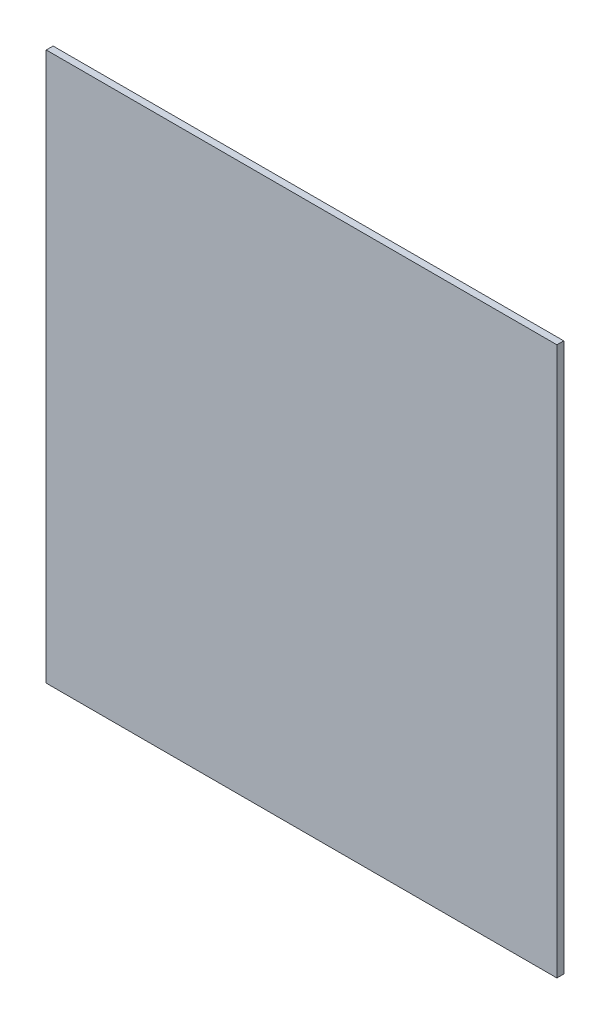
ISO-10303-21;
HEADER;
FILE_DESCRIPTION(('STEP AP214'),'2;1');
FILE_NAME('part.step','',(''),(''),'','','');
FILE_SCHEMA(('AUTOMOTIVE_DESIGN { 1 0 10303 214 1 1 1 1 }'));
ENDSEC;
DATA;
#1=APPLICATION_CONTEXT('core data for automotive mechanical design processes');
#2=APPLICATION_PROTOCOL_DEFINITION('international standard','automotive_design',2000,#1);
#3=PRODUCT_CONTEXT('',#1,'mechanical');
#4=PRODUCT('Part','Part','',(#3));
#5=PRODUCT_RELATED_PRODUCT_CATEGORY('part','',(#4));
#6=PRODUCT_DEFINITION_FORMATION('','',#4);
#7=PRODUCT_DEFINITION_CONTEXT('part definition',#1,'design');
#8=PRODUCT_DEFINITION('design','',#6,#7);
#9=PRODUCT_DEFINITION_SHAPE('','',#8);
#10=(LENGTH_UNIT() NAMED_UNIT(*) SI_UNIT(.MILLI.,.METRE.));
#11=(NAMED_UNIT(*) PLANE_ANGLE_UNIT() SI_UNIT($,.RADIAN.));
#12=(NAMED_UNIT(*) SI_UNIT($,.STERADIAN.) SOLID_ANGLE_UNIT());
#13=UNCERTAINTY_MEASURE_WITH_UNIT(LENGTH_MEASURE(1.E-05),#10,'distance_accuracy_value','');
#14=(GEOMETRIC_REPRESENTATION_CONTEXT(3) GLOBAL_UNCERTAINTY_ASSIGNED_CONTEXT((#13)) GLOBAL_UNIT_ASSIGNED_CONTEXT((#10,
#11,#12)) REPRESENTATION_CONTEXT('',''));
#15=CARTESIAN_POINT('',(0.,0.,0.));
#16=DIRECTION('',(0.,0.,1.));
#17=DIRECTION('',(1.,0.,0.));
#18=AXIS2_PLACEMENT_3D('',#15,#16,#17);
#19=CARTESIAN_POINT('',(74.5,-80.,2.));
#20=DIRECTION('',(-1.,0.,0.));
#21=DIRECTION('',(0.,0.,1.));
#22=AXIS2_PLACEMENT_3D('',#19,#20,#21);
#23=PLANE('',#22);
#24=DIRECTION('',(0.,1.,0.));
#25=VECTOR('',#24,1.);
#26=CARTESIAN_POINT('',(74.5,-80.,0.));
#27=LINE('',#26,#25);
#28=CARTESIAN_POINT('',(74.5,-80.,0.));
#29=VERTEX_POINT('',#28);
#30=CARTESIAN_POINT('',(74.5,80.,0.));
#31=VERTEX_POINT('',#30);
#32=EDGE_CURVE('E131',#29,#31,#27,.T.);
#33=ORIENTED_EDGE('',*,*,#32,.T.);
#34=DIRECTION('',(0.,0.,-1.));
#35=VECTOR('',#34,1.);
#36=CARTESIAN_POINT('',(74.5,80.,2.));
#37=LINE('',#36,#35);
#38=CARTESIAN_POINT('',(74.5,80.,2.));
#39=VERTEX_POINT('',#38);
#40=EDGE_CURVE('E42',#39,#31,#37,.T.);
#41=ORIENTED_EDGE('',*,*,#40,.F.);
#42=DIRECTION('',(0.,1.,0.));
#43=VECTOR('',#42,1.);
#44=CARTESIAN_POINT('',(74.5,-80.,2.));
#45=LINE('',#44,#43);
#46=CARTESIAN_POINT('',(74.5,-80.,2.));
#47=VERTEX_POINT('',#46);
#48=EDGE_CURVE('E119',#47,#39,#45,.T.);
#49=ORIENTED_EDGE('',*,*,#48,.F.);
#50=DIRECTION('',(0.,0.,-1.));
#51=VECTOR('',#50,1.);
#52=CARTESIAN_POINT('',(74.5,-80.,2.));
#53=LINE('',#52,#51);
#54=EDGE_CURVE('E127',#47,#29,#53,.T.);
#55=ORIENTED_EDGE('',*,*,#54,.T.);
#56=EDGE_LOOP('',(#33,#41,#49,#55));
#57=FACE_BOUND('',#56,.T.);
#58=ADVANCED_FACE('F68',(#57),#23,.F.);
#59=CARTESIAN_POINT('',(-74.5,80.,2.));
#60=DIRECTION('',(0.,-1.,0.));
#61=DIRECTION('',(0.,0.,-1.));
#62=AXIS2_PLACEMENT_3D('',#59,#60,#61);
#63=PLANE('',#62);
#64=DIRECTION('',(-1.,0.,0.));
#65=VECTOR('',#64,1.);
#66=CARTESIAN_POINT('',(-74.5,80.,0.));
#67=LINE('',#66,#65);
#68=CARTESIAN_POINT('',(-74.5,80.,0.));
#69=VERTEX_POINT('',#68);
#70=EDGE_CURVE('E123',#31,#69,#67,.T.);
#71=ORIENTED_EDGE('',*,*,#70,.T.);
#72=DIRECTION('',(0.,0.,-1.));
#73=VECTOR('',#72,1.);
#74=CARTESIAN_POINT('',(-74.5,80.,2.));
#75=LINE('',#74,#73);
#76=CARTESIAN_POINT('',(-74.5,80.,2.));
#77=VERTEX_POINT('',#76);
#78=EDGE_CURVE('E76',#77,#69,#75,.T.);
#79=ORIENTED_EDGE('',*,*,#78,.F.);
#80=DIRECTION('',(-1.,0.,0.));
#81=VECTOR('',#80,1.);
#82=CARTESIAN_POINT('',(-74.5,80.,2.));
#83=LINE('',#82,#81);
#84=EDGE_CURVE('E114',#39,#77,#83,.T.);
#85=ORIENTED_EDGE('',*,*,#84,.F.);
#86=ORIENTED_EDGE('',*,*,#40,.T.);
#87=EDGE_LOOP('',(#71,#79,#85,#86));
#88=FACE_BOUND('',#87,.T.);
#89=ADVANCED_FACE('F122',(#88),#63,.F.);
#90=CARTESIAN_POINT('',(-74.5,-80.,2.));
#91=DIRECTION('',(1.,0.,0.));
#92=DIRECTION('',(0.,0.,-1.));
#93=AXIS2_PLACEMENT_3D('',#90,#91,#92);
#94=PLANE('',#93);
#95=DIRECTION('',(0.,-1.,0.));
#96=VECTOR('',#95,1.);
#97=CARTESIAN_POINT('',(-74.5,-80.,0.));
#98=LINE('',#97,#96);
#99=CARTESIAN_POINT('',(-74.5,-80.,0.));
#100=VERTEX_POINT('',#99);
#101=EDGE_CURVE('E101',#69,#100,#98,.T.);
#102=ORIENTED_EDGE('',*,*,#101,.T.);
#103=DIRECTION('',(0.,0.,-1.));
#104=VECTOR('',#103,1.);
#105=CARTESIAN_POINT('',(-74.5,-80.,2.));
#106=LINE('',#105,#104);
#107=CARTESIAN_POINT('',(-74.5,-80.,2.));
#108=VERTEX_POINT('',#107);
#109=EDGE_CURVE('E124',#108,#100,#106,.T.);
#110=ORIENTED_EDGE('',*,*,#109,.F.);
#111=DIRECTION('',(0.,-1.,0.));
#112=VECTOR('',#111,1.);
#113=CARTESIAN_POINT('',(-74.5,-80.,2.));
#114=LINE('',#113,#112);
#115=EDGE_CURVE('E117',#77,#108,#114,.T.);
#116=ORIENTED_EDGE('',*,*,#115,.F.);
#117=ORIENTED_EDGE('',*,*,#78,.T.);
#118=EDGE_LOOP('',(#102,#110,#116,#117));
#119=FACE_BOUND('',#118,.T.);
#120=ADVANCED_FACE('F125',(#119),#94,.F.);
#121=CARTESIAN_POINT('',(-74.5,-80.,2.));
#122=DIRECTION('',(0.,1.,0.));
#123=DIRECTION('',(0.,0.,1.));
#124=AXIS2_PLACEMENT_3D('',#121,#122,#123);
#125=PLANE('',#124);
#126=DIRECTION('',(1.,0.,0.));
#127=VECTOR('',#126,1.);
#128=CARTESIAN_POINT('',(-74.5,-80.,0.));
#129=LINE('',#128,#127);
#130=EDGE_CURVE('E107',#100,#29,#129,.T.);
#131=ORIENTED_EDGE('',*,*,#130,.T.);
#132=ORIENTED_EDGE('',*,*,#54,.F.);
#133=DIRECTION('',(1.,0.,0.));
#134=VECTOR('',#133,1.);
#135=CARTESIAN_POINT('',(-74.5,-80.,2.));
#136=LINE('',#135,#134);
#137=EDGE_CURVE('E84',#108,#47,#136,.T.);
#138=ORIENTED_EDGE('',*,*,#137,.F.);
#139=ORIENTED_EDGE('',*,*,#109,.T.);
#140=EDGE_LOOP('',(#131,#132,#138,#139));
#141=FACE_BOUND('',#140,.T.);
#142=ADVANCED_FACE('F138',(#141),#125,.F.);
#143=CARTESIAN_POINT('',(0.,0.,2.));
#144=DIRECTION('',(0.,0.,-1.));
#145=DIRECTION('',(-1.,0.,0.));
#146=AXIS2_PLACEMENT_3D('',#143,#144,#145);
#147=PLANE('',#146);
#148=ORIENTED_EDGE('',*,*,#48,.T.);
#149=ORIENTED_EDGE('',*,*,#84,.T.);
#150=ORIENTED_EDGE('',*,*,#115,.T.);
#151=ORIENTED_EDGE('',*,*,#137,.T.);
#152=EDGE_LOOP('',(#148,#149,#150,#151));
#153=FACE_BOUND('',#152,.T.);
#154=ADVANCED_FACE('F115',(#153),#147,.F.);
#155=CARTESIAN_POINT('',(0.,0.,0.));
#156=DIRECTION('',(0.,0.,-1.));
#157=DIRECTION('',(-1.,0.,0.));
#158=AXIS2_PLACEMENT_3D('',#155,#156,#157);
#159=PLANE('',#158);
#160=ORIENTED_EDGE('',*,*,#32,.F.);
#161=ORIENTED_EDGE('',*,*,#130,.F.);
#162=ORIENTED_EDGE('',*,*,#101,.F.);
#163=ORIENTED_EDGE('',*,*,#70,.F.);
#164=EDGE_LOOP('',(#160,#161,#162,#163));
#165=FACE_BOUND('',#164,.T.);
#166=ADVANCED_FACE('F141',(#165),#159,.T.);
#167=CLOSED_SHELL('',(#58,#89,#120,#142,#154,#166));
#168=MANIFOLD_SOLID_BREP('B6',#167);
#169=ADVANCED_BREP_SHAPE_REPRESENTATION('',(#18,#168),#14);
#170=SHAPE_DEFINITION_REPRESENTATION(#9,#169);
ENDSEC;
END-ISO-10303-21;
